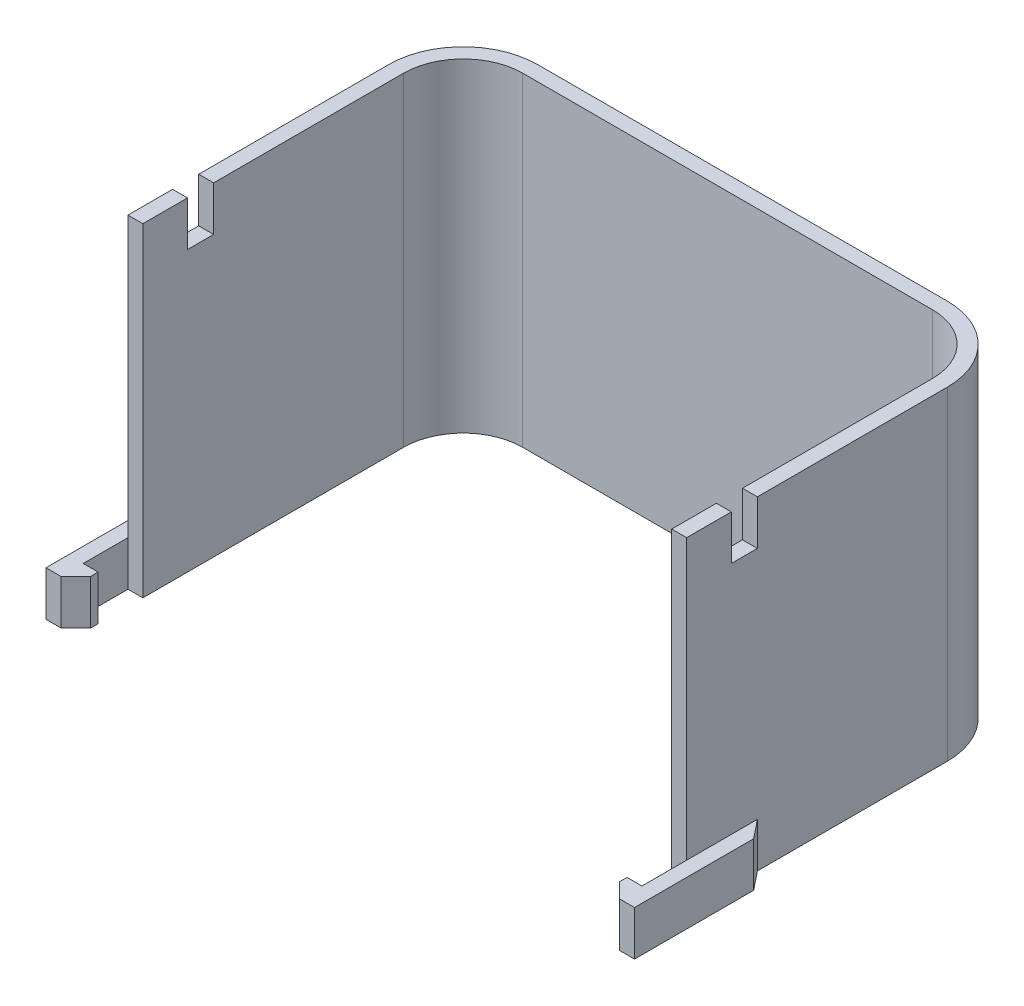
ISO-10303-21;
HEADER;
FILE_DESCRIPTION(('STEP AP214'),'2;1');
FILE_NAME('part.step','',(''),(''),'','','');
FILE_SCHEMA(('AUTOMOTIVE_DESIGN { 1 0 10303 214 1 1 1 1 }'));
ENDSEC;
DATA;
#1=APPLICATION_CONTEXT('core data for automotive mechanical design processes');
#2=APPLICATION_PROTOCOL_DEFINITION('international standard','automotive_design',2000,#1);
#3=PRODUCT_CONTEXT('',#1,'mechanical');
#4=PRODUCT('Part','Part','',(#3));
#5=PRODUCT_RELATED_PRODUCT_CATEGORY('part','',(#4));
#6=PRODUCT_DEFINITION_FORMATION('','',#4);
#7=PRODUCT_DEFINITION_CONTEXT('part definition',#1,'design');
#8=PRODUCT_DEFINITION('design','',#6,#7);
#9=PRODUCT_DEFINITION_SHAPE('','',#8);
#10=(LENGTH_UNIT() NAMED_UNIT(*) SI_UNIT(.MILLI.,.METRE.));
#11=(NAMED_UNIT(*) PLANE_ANGLE_UNIT() SI_UNIT($,.RADIAN.));
#12=(NAMED_UNIT(*) SI_UNIT($,.STERADIAN.) SOLID_ANGLE_UNIT());
#13=UNCERTAINTY_MEASURE_WITH_UNIT(LENGTH_MEASURE(1.E-05),#10,'distance_accuracy_value','');
#14=(GEOMETRIC_REPRESENTATION_CONTEXT(3) GLOBAL_UNCERTAINTY_ASSIGNED_CONTEXT((#13)) GLOBAL_UNIT_ASSIGNED_CONTEXT((#10,
#11,#12)) REPRESENTATION_CONTEXT('',''));
#15=CARTESIAN_POINT('',(0.,0.,0.));
#16=DIRECTION('',(0.,0.,1.));
#17=DIRECTION('',(1.,0.,0.));
#18=AXIS2_PLACEMENT_3D('',#15,#16,#17);
#19=CARTESIAN_POINT('',(0.,43.5,0.));
#20=DIRECTION('',(0.,-1.,0.));
#21=DIRECTION('',(0.,0.,-1.));
#22=AXIS2_PLACEMENT_3D('',#19,#20,#21);
#23=PLANE('',#22);
#24=DIRECTION('',(0.,0.,-1.));
#25=VECTOR('',#24,1.);
#26=CARTESIAN_POINT('',(-35.6068430701382,43.5,-43.));
#27=LINE('',#26,#25);
#28=CARTESIAN_POINT('',(-35.6068430701382,43.5,0.));
#29=VERTEX_POINT('',#28);
#30=CARTESIAN_POINT('',(-35.6068430701382,43.5,-6.));
#31=VERTEX_POINT('',#30);
#32=EDGE_CURVE('E510',#29,#31,#27,.T.);
#33=ORIENTED_EDGE('',*,*,#32,.T.);
#34=DIRECTION('',(-1.,0.,0.));
#35=VECTOR('',#34,1.);
#36=CARTESIAN_POINT('',(0.,43.5,-6.));
#37=LINE('',#36,#35);
#38=CARTESIAN_POINT('',(-37.6068430701382,43.5,-6.));
#39=VERTEX_POINT('',#38);
#40=EDGE_CURVE('E635',#31,#39,#37,.T.);
#41=ORIENTED_EDGE('',*,*,#40,.T.);
#42=DIRECTION('',(0.,0.,1.));
#43=VECTOR('',#42,1.);
#44=CARTESIAN_POINT('',(-37.6068430701382,43.5,0.));
#45=LINE('',#44,#43);
#46=CARTESIAN_POINT('',(-37.6068430701382,43.5,0.));
#47=VERTEX_POINT('',#46);
#48=EDGE_CURVE('E506',#39,#47,#45,.T.);
#49=ORIENTED_EDGE('',*,*,#48,.T.);
#50=DIRECTION('',(1.,0.,0.));
#51=VECTOR('',#50,1.);
#52=CARTESIAN_POINT('',(-37.6068430701382,43.5,0.));
#53=LINE('',#52,#51);
#54=EDGE_CURVE('E505',#47,#29,#53,.T.);
#55=ORIENTED_EDGE('',*,*,#54,.T.);
#56=EDGE_LOOP('',(#33,#41,#49,#55));
#57=FACE_BOUND('',#56,.T.);
#58=ADVANCED_FACE('F45',(#57),#23,.F.);
#59=DIRECTION('',(0.,0.,-1.));
#60=VECTOR('',#59,1.);
#61=CARTESIAN_POINT('',(37.3931569298619,43.5,0.));
#62=LINE('',#61,#60);
#63=CARTESIAN_POINT('',(37.3931569298619,43.5,0.));
#64=VERTEX_POINT('',#63);
#65=CARTESIAN_POINT('',(37.3931569298619,43.5,-6.));
#66=VERTEX_POINT('',#65);
#67=EDGE_CURVE('E527',#64,#66,#62,.T.);
#68=ORIENTED_EDGE('',*,*,#67,.T.);
#69=CARTESIAN_POINT('',(35.3931569298618,43.5,-6.));
#70=VERTEX_POINT('',#69);
#71=EDGE_CURVE('E54',#66,#70,#37,.T.);
#72=ORIENTED_EDGE('',*,*,#71,.T.);
#73=DIRECTION('',(0.,0.,1.));
#74=VECTOR('',#73,1.);
#75=CARTESIAN_POINT('',(35.3931569298618,43.5,-43.));
#76=LINE('',#75,#74);
#77=CARTESIAN_POINT('',(35.3931569298618,43.5,0.));
#78=VERTEX_POINT('',#77);
#79=EDGE_CURVE('E518',#70,#78,#76,.T.);
#80=ORIENTED_EDGE('',*,*,#79,.T.);
#81=DIRECTION('',(1.,0.,0.));
#82=VECTOR('',#81,1.);
#83=CARTESIAN_POINT('',(35.3931569298618,43.5,0.));
#84=LINE('',#83,#82);
#85=EDGE_CURVE('E523',#78,#64,#84,.T.);
#86=ORIENTED_EDGE('',*,*,#85,.T.);
#87=EDGE_LOOP('',(#68,#72,#80,#86));
#88=FACE_BOUND('',#87,.T.);
#89=ADVANCED_FACE('F751',(#88),#23,.F.);
#90=CARTESIAN_POINT('',(-37.6068430701382,43.5,0.));
#91=DIRECTION('',(1.,0.,0.));
#92=DIRECTION('',(0.,0.,-1.));
#93=AXIS2_PLACEMENT_3D('',#90,#91,#92);
#94=PLANE('',#93);
#95=DIRECTION('',(0.,0.,1.));
#96=VECTOR('',#95,1.);
#97=CARTESIAN_POINT('',(-37.6068430701382,0.,0.));
#98=LINE('',#97,#96);
#99=CARTESIAN_POINT('',(-37.6068430701382,0.,-35.));
#100=VERTEX_POINT('',#99);
#101=CARTESIAN_POINT('',(-37.6068430701382,0.,-9.5));
#102=VERTEX_POINT('',#101);
#103=EDGE_CURVE('E500',#100,#102,#98,.T.);
#104=ORIENTED_EDGE('',*,*,#103,.T.);
#105=DIRECTION('',(0.,-1.,0.));
#106=VECTOR('',#105,1.);
#107=CARTESIAN_POINT('',(-37.6068430701382,6.,-9.5));
#108=LINE('',#107,#106);
#109=CARTESIAN_POINT('',(-37.6068430701382,6.,-9.5));
#110=VERTEX_POINT('',#109);
#111=EDGE_CURVE('E61',#110,#102,#108,.T.);
#112=ORIENTED_EDGE('',*,*,#111,.F.);
#113=DIRECTION('',(0.,0.,1.));
#114=VECTOR('',#113,1.);
#115=CARTESIAN_POINT('',(-37.6068430701382,6.,-9.5));
#116=LINE('',#115,#114);
#117=CARTESIAN_POINT('',(-37.6068430701382,6.,0.));
#118=VERTEX_POINT('',#117);
#119=EDGE_CURVE('E65',#110,#118,#116,.T.);
#120=ORIENTED_EDGE('',*,*,#119,.T.);
#121=DIRECTION('',(0.,-1.,0.));
#122=VECTOR('',#121,1.);
#123=CARTESIAN_POINT('',(-37.6068430701382,43.5,0.));
#124=LINE('',#123,#122);
#125=EDGE_CURVE('E573',#47,#118,#124,.T.);
#126=ORIENTED_EDGE('',*,*,#125,.F.);
#127=ORIENTED_EDGE('',*,*,#48,.F.);
#128=DIRECTION('',(0.,-1.,0.));
#129=VECTOR('',#128,1.);
#130=CARTESIAN_POINT('',(-37.6068430701382,43.5,-6.));
#131=LINE('',#130,#129);
#132=CARTESIAN_POINT('',(-37.6068430701382,37.5,-6.));
#133=VERTEX_POINT('',#132);
#134=EDGE_CURVE('E484',#39,#133,#131,.T.);
#135=ORIENTED_EDGE('',*,*,#134,.T.);
#136=DIRECTION('',(0.,0.,-1.));
#137=VECTOR('',#136,1.);
#138=CARTESIAN_POINT('',(-37.6068430701382,37.5,0.));
#139=LINE('',#138,#137);
#140=CARTESIAN_POINT('',(-37.6068430701382,37.5,-9.5));
#141=VERTEX_POINT('',#140);
#142=EDGE_CURVE('E496',#133,#141,#139,.T.);
#143=ORIENTED_EDGE('',*,*,#142,.T.);
#144=DIRECTION('',(0.,1.,0.));
#145=VECTOR('',#144,1.);
#146=CARTESIAN_POINT('',(-37.6068430701382,43.5,-9.5));
#147=LINE('',#146,#145);
#148=CARTESIAN_POINT('',(-37.6068430701382,43.5,-9.5));
#149=VERTEX_POINT('',#148);
#150=EDGE_CURVE('E468',#141,#149,#147,.T.);
#151=ORIENTED_EDGE('',*,*,#150,.T.);
#152=CARTESIAN_POINT('',(-37.6068430701382,43.5,-35.));
#153=VERTEX_POINT('',#152);
#154=EDGE_CURVE('E501',#153,#149,#45,.T.);
#155=ORIENTED_EDGE('',*,*,#154,.F.);
#156=DIRECTION('',(0.,-1.,0.));
#157=VECTOR('',#156,1.);
#158=CARTESIAN_POINT('',(-37.6068430701382,43.5,-35.));
#159=LINE('',#158,#157);
#160=EDGE_CURVE('E603',#153,#100,#159,.T.);
#161=ORIENTED_EDGE('',*,*,#160,.T.);
#162=EDGE_LOOP('',(#104,#112,#120,#126,#127,#135,#143,#151,#155,#161));
#163=FACE_BOUND('',#162,.T.);
#164=ADVANCED_FACE('F731',(#163),#94,.F.);
#165=CARTESIAN_POINT('',(-37.6068430701382,43.5,0.));
#166=DIRECTION('',(0.,0.,-1.));
#167=DIRECTION('',(-1.,0.,0.));
#168=AXIS2_PLACEMENT_3D('',#165,#166,#167);
#169=PLANE('',#168);
#170=DIRECTION('',(1.,0.,0.));
#171=VECTOR('',#170,1.);
#172=CARTESIAN_POINT('',(-37.6068430701382,0.,0.));
#173=LINE('',#172,#171);
#174=CARTESIAN_POINT('',(-37.6068430701382,0.,0.));
#175=VERTEX_POINT('',#174);
#176=CARTESIAN_POINT('',(-35.6068430701382,0.,0.));
#177=VERTEX_POINT('',#176);
#178=EDGE_CURVE('E538',#175,#177,#173,.T.);
#179=ORIENTED_EDGE('',*,*,#178,.T.);
#180=DIRECTION('',(0.,-1.,0.));
#181=VECTOR('',#180,1.);
#182=CARTESIAN_POINT('',(-35.6068430701382,43.5,0.));
#183=LINE('',#182,#181);
#184=EDGE_CURVE('E569',#29,#177,#183,.T.);
#185=ORIENTED_EDGE('',*,*,#184,.F.);
#186=ORIENTED_EDGE('',*,*,#54,.F.);
#187=ORIENTED_EDGE('',*,*,#125,.T.);
#188=DIRECTION('',(0.,-1.,0.));
#189=VECTOR('',#188,1.);
#190=CARTESIAN_POINT('',(-37.6068430701382,43.5,0.));
#191=LINE('',#190,#189);
#192=EDGE_CURVE('E280',#118,#175,#191,.T.);
#193=ORIENTED_EDGE('',*,*,#192,.T.);
#194=EDGE_LOOP('',(#179,#185,#186,#187,#193));
#195=FACE_BOUND('',#194,.T.);
#196=ADVANCED_FACE('F668',(#195),#169,.F.);
#197=CARTESIAN_POINT('',(-35.6068430701382,43.5,-43.));
#198=DIRECTION('',(-1.,0.,0.));
#199=DIRECTION('',(0.,0.,1.));
#200=AXIS2_PLACEMENT_3D('',#197,#198,#199);
#201=PLANE('',#200);
#202=DIRECTION('',(0.,0.,1.));
#203=VECTOR('',#202,1.);
#204=CARTESIAN_POINT('',(-35.6068430701382,37.5,-43.));
#205=LINE('',#204,#203);
#206=CARTESIAN_POINT('',(-35.6068430701382,37.5,-9.5));
#207=VERTEX_POINT('',#206);
#208=CARTESIAN_POINT('',(-35.6068430701382,37.5,-6.));
#209=VERTEX_POINT('',#208);
#210=EDGE_CURVE('E492',#207,#209,#205,.T.);
#211=ORIENTED_EDGE('',*,*,#210,.T.);
#212=DIRECTION('',(0.,1.,0.));
#213=VECTOR('',#212,1.);
#214=CARTESIAN_POINT('',(-35.6068430701382,43.5,-6.));
#215=LINE('',#214,#213);
#216=EDGE_CURVE('E480',#209,#31,#215,.T.);
#217=ORIENTED_EDGE('',*,*,#216,.T.);
#218=ORIENTED_EDGE('',*,*,#32,.F.);
#219=ORIENTED_EDGE('',*,*,#184,.T.);
#220=DIRECTION('',(0.,0.,-1.));
#221=VECTOR('',#220,1.);
#222=CARTESIAN_POINT('',(-35.6068430701382,0.,-43.));
#223=LINE('',#222,#221);
#224=CARTESIAN_POINT('',(-35.6068430701382,0.,-35.));
#225=VERTEX_POINT('',#224);
#226=EDGE_CURVE('E541',#177,#225,#223,.T.);
#227=ORIENTED_EDGE('',*,*,#226,.T.);
#228=DIRECTION('',(0.,-1.,0.));
#229=VECTOR('',#228,1.);
#230=CARTESIAN_POINT('',(-35.6068430701382,43.5,-35.));
#231=LINE('',#230,#229);
#232=CARTESIAN_POINT('',(-35.6068430701382,43.5,-35.));
#233=VERTEX_POINT('',#232);
#234=EDGE_CURVE('E587',#225,#233,#231,.F.);
#235=ORIENTED_EDGE('',*,*,#234,.T.);
#236=CARTESIAN_POINT('',(-35.6068430701382,43.5,-9.5));
#237=VERTEX_POINT('',#236);
#238=EDGE_CURVE('E509',#237,#233,#27,.T.);
#239=ORIENTED_EDGE('',*,*,#238,.F.);
#240=DIRECTION('',(0.,-1.,0.));
#241=VECTOR('',#240,1.);
#242=CARTESIAN_POINT('',(-35.6068430701382,43.5,-9.5));
#243=LINE('',#242,#241);
#244=EDGE_CURVE('E464',#237,#207,#243,.T.);
#245=ORIENTED_EDGE('',*,*,#244,.T.);
#246=EDGE_LOOP('',(#211,#217,#218,#219,#227,#235,#239,#245));
#247=FACE_BOUND('',#246,.T.);
#248=ADVANCED_FACE('F650',(#247),#201,.F.);
#249=CARTESIAN_POINT('',(-35.6068430701382,43.5,-43.));
#250=DIRECTION('',(0.,0.,-1.));
#251=DIRECTION('',(-1.,0.,0.));
#252=AXIS2_PLACEMENT_3D('',#249,#250,#251);
#253=PLANE('',#252);
#254=DIRECTION('',(1.,0.,0.));
#255=VECTOR('',#254,1.);
#256=CARTESIAN_POINT('',(-35.6068430701382,0.,-43.));
#257=LINE('',#256,#255);
#258=CARTESIAN_POINT('',(-27.6068430701382,0.,-43.));
#259=VERTEX_POINT('',#258);
#260=CARTESIAN_POINT('',(27.3931569298618,0.,-43.));
#261=VERTEX_POINT('',#260);
#262=EDGE_CURVE('E545',#259,#261,#257,.T.);
#263=ORIENTED_EDGE('',*,*,#262,.T.);
#264=DIRECTION('',(0.,-1.,0.));
#265=VECTOR('',#264,1.);
#266=CARTESIAN_POINT('',(27.3931569298618,43.5,-43.));
#267=LINE('',#266,#265);
#268=CARTESIAN_POINT('',(27.3931569298618,43.5,-43.));
#269=VERTEX_POINT('',#268);
#270=EDGE_CURVE('E584',#261,#269,#267,.F.);
#271=ORIENTED_EDGE('',*,*,#270,.T.);
#272=DIRECTION('',(1.,0.,0.));
#273=VECTOR('',#272,1.);
#274=CARTESIAN_POINT('',(-35.6068430701382,43.5,-43.));
#275=LINE('',#274,#273);
#276=CARTESIAN_POINT('',(-27.6068430701382,43.5,-43.));
#277=VERTEX_POINT('',#276);
#278=EDGE_CURVE('E514',#277,#269,#275,.T.);
#279=ORIENTED_EDGE('',*,*,#278,.F.);
#280=DIRECTION('',(0.,-1.,0.));
#281=VECTOR('',#280,1.);
#282=CARTESIAN_POINT('',(-27.6068430701382,0.,-43.));
#283=LINE('',#282,#281);
#284=EDGE_CURVE('E580',#277,#259,#283,.T.);
#285=ORIENTED_EDGE('',*,*,#284,.T.);
#286=EDGE_LOOP('',(#263,#271,#279,#285));
#287=FACE_BOUND('',#286,.T.);
#288=ADVANCED_FACE('F679',(#287),#253,.F.);
#289=CARTESIAN_POINT('',(35.3931569298618,43.5,-43.));
#290=DIRECTION('',(1.,0.,0.));
#291=DIRECTION('',(0.,0.,-1.));
#292=AXIS2_PLACEMENT_3D('',#289,#290,#291);
#293=PLANE('',#292);
#294=ORIENTED_EDGE('',*,*,#79,.F.);
#295=DIRECTION('',(0.,-1.,0.));
#296=VECTOR('',#295,1.);
#297=CARTESIAN_POINT('',(35.3931569298618,43.5,-6.));
#298=LINE('',#297,#296);
#299=CARTESIAN_POINT('',(35.3931569298618,37.5,-6.));
#300=VERTEX_POINT('',#299);
#301=EDGE_CURVE('E476',#70,#300,#298,.T.);
#302=ORIENTED_EDGE('',*,*,#301,.T.);
#303=DIRECTION('',(0.,0.,-1.));
#304=VECTOR('',#303,1.);
#305=CARTESIAN_POINT('',(35.3931569298618,37.5,-43.));
#306=LINE('',#305,#304);
#307=CARTESIAN_POINT('',(35.3931569298618,37.5,-9.5));
#308=VERTEX_POINT('',#307);
#309=EDGE_CURVE('E488',#300,#308,#306,.T.);
#310=ORIENTED_EDGE('',*,*,#309,.T.);
#311=DIRECTION('',(0.,1.,0.));
#312=VECTOR('',#311,1.);
#313=CARTESIAN_POINT('',(35.3931569298618,43.5,-9.5));
#314=LINE('',#313,#312);
#315=CARTESIAN_POINT('',(35.3931569298618,43.5,-9.5));
#316=VERTEX_POINT('',#315);
#317=EDGE_CURVE('E460',#308,#316,#314,.T.);
#318=ORIENTED_EDGE('',*,*,#317,.T.);
#319=CARTESIAN_POINT('',(35.3931569298618,43.5,-35.));
#320=VERTEX_POINT('',#319);
#321=EDGE_CURVE('E519',#320,#316,#76,.T.);
#322=ORIENTED_EDGE('',*,*,#321,.F.);
#323=DIRECTION('',(0.,-1.,0.));
#324=VECTOR('',#323,1.);
#325=CARTESIAN_POINT('',(35.3931569298618,0.,-35.));
#326=LINE('',#325,#324);
#327=CARTESIAN_POINT('',(35.3931569298618,0.,-35.));
#328=VERTEX_POINT('',#327);
#329=EDGE_CURVE('E576',#320,#328,#326,.T.);
#330=ORIENTED_EDGE('',*,*,#329,.T.);
#331=DIRECTION('',(0.,0.,1.));
#332=VECTOR('',#331,1.);
#333=CARTESIAN_POINT('',(35.3931569298618,0.,-43.));
#334=LINE('',#333,#332);
#335=CARTESIAN_POINT('',(35.3931569298618,0.,0.));
#336=VERTEX_POINT('',#335);
#337=EDGE_CURVE('E549',#328,#336,#334,.T.);
#338=ORIENTED_EDGE('',*,*,#337,.T.);
#339=DIRECTION('',(0.,-1.,0.));
#340=VECTOR('',#339,1.);
#341=CARTESIAN_POINT('',(35.3931569298618,43.5,0.));
#342=LINE('',#341,#340);
#343=EDGE_CURVE('E565',#78,#336,#342,.T.);
#344=ORIENTED_EDGE('',*,*,#343,.F.);
#345=EDGE_LOOP('',(#294,#302,#310,#318,#322,#330,#338,#344));
#346=FACE_BOUND('',#345,.T.);
#347=ADVANCED_FACE('F689',(#346),#293,.F.);
#348=CARTESIAN_POINT('',(35.3931569298618,43.5,0.));
#349=DIRECTION('',(0.,0.,-1.));
#350=DIRECTION('',(-1.,0.,0.));
#351=AXIS2_PLACEMENT_3D('',#348,#349,#350);
#352=PLANE('',#351);
#353=DIRECTION('',(1.,0.,0.));
#354=VECTOR('',#353,1.);
#355=CARTESIAN_POINT('',(35.3931569298618,0.,0.));
#356=LINE('',#355,#354);
#357=CARTESIAN_POINT('',(37.3931569298619,0.,0.));
#358=VERTEX_POINT('',#357);
#359=EDGE_CURVE('E552',#336,#358,#356,.T.);
#360=ORIENTED_EDGE('',*,*,#359,.T.);
#361=DIRECTION('',(0.,1.,0.));
#362=VECTOR('',#361,1.);
#363=CARTESIAN_POINT('',(37.3931569298619,43.5,0.));
#364=LINE('',#363,#362);
#365=CARTESIAN_POINT('',(37.3931569298619,6.,0.));
#366=VERTEX_POINT('',#365);
#367=EDGE_CURVE('E349',#358,#366,#364,.T.);
#368=ORIENTED_EDGE('',*,*,#367,.T.);
#369=DIRECTION('',(0.,-1.,0.));
#370=VECTOR('',#369,1.);
#371=CARTESIAN_POINT('',(37.3931569298619,43.5,0.));
#372=LINE('',#371,#370);
#373=EDGE_CURVE('E535',#64,#366,#372,.T.);
#374=ORIENTED_EDGE('',*,*,#373,.F.);
#375=ORIENTED_EDGE('',*,*,#85,.F.);
#376=ORIENTED_EDGE('',*,*,#343,.T.);
#377=EDGE_LOOP('',(#360,#368,#374,#375,#376));
#378=FACE_BOUND('',#377,.T.);
#379=ADVANCED_FACE('F695',(#378),#352,.F.);
#380=CARTESIAN_POINT('',(37.3931569298619,43.5,0.));
#381=DIRECTION('',(-1.,0.,0.));
#382=DIRECTION('',(0.,0.,1.));
#383=AXIS2_PLACEMENT_3D('',#380,#381,#382);
#384=PLANE('',#383);
#385=DIRECTION('',(0.,0.,-1.));
#386=VECTOR('',#385,1.);
#387=CARTESIAN_POINT('',(37.3931569298618,6.,-9.5));
#388=LINE('',#387,#386);
#389=CARTESIAN_POINT('',(37.3931569298619,6.,-9.5));
#390=VERTEX_POINT('',#389);
#391=EDGE_CURVE('E438',#366,#390,#388,.T.);
#392=ORIENTED_EDGE('',*,*,#391,.T.);
#393=DIRECTION('',(0.,-1.,0.));
#394=VECTOR('',#393,1.);
#395=CARTESIAN_POINT('',(37.3931569298618,6.,-9.5));
#396=LINE('',#395,#394);
#397=CARTESIAN_POINT('',(37.3931569298618,0.,-9.5));
#398=VERTEX_POINT('',#397);
#399=EDGE_CURVE('E364',#390,#398,#396,.T.);
#400=ORIENTED_EDGE('',*,*,#399,.T.);
#401=DIRECTION('',(0.,0.,-1.));
#402=VECTOR('',#401,1.);
#403=CARTESIAN_POINT('',(37.3931569298619,0.,0.));
#404=LINE('',#403,#402);
#405=CARTESIAN_POINT('',(37.3931569298618,0.,-35.));
#406=VERTEX_POINT('',#405);
#407=EDGE_CURVE('E555',#398,#406,#404,.T.);
#408=ORIENTED_EDGE('',*,*,#407,.T.);
#409=DIRECTION('',(0.,-1.,0.));
#410=VECTOR('',#409,1.);
#411=CARTESIAN_POINT('',(37.3931569298618,43.5,-35.));
#412=LINE('',#411,#410);
#413=CARTESIAN_POINT('',(37.3931569298618,43.5,-35.));
#414=VERTEX_POINT('',#413);
#415=EDGE_CURVE('E627',#406,#414,#412,.F.);
#416=ORIENTED_EDGE('',*,*,#415,.T.);
#417=CARTESIAN_POINT('',(37.3931569298619,43.5,-9.5));
#418=VERTEX_POINT('',#417);
#419=EDGE_CURVE('E526',#418,#414,#62,.T.);
#420=ORIENTED_EDGE('',*,*,#419,.F.);
#421=DIRECTION('',(0.,-1.,0.));
#422=VECTOR('',#421,1.);
#423=CARTESIAN_POINT('',(37.3931569298619,43.5,-9.5));
#424=LINE('',#423,#422);
#425=CARTESIAN_POINT('',(37.3931569298619,37.5,-9.5));
#426=VERTEX_POINT('',#425);
#427=EDGE_CURVE('E456',#418,#426,#424,.T.);
#428=ORIENTED_EDGE('',*,*,#427,.T.);
#429=DIRECTION('',(0.,0.,1.));
#430=VECTOR('',#429,1.);
#431=CARTESIAN_POINT('',(37.3931569298619,37.5,0.));
#432=LINE('',#431,#430);
#433=CARTESIAN_POINT('',(37.3931569298619,37.5,-6.));
#434=VERTEX_POINT('',#433);
#435=EDGE_CURVE('E11',#426,#434,#432,.T.);
#436=ORIENTED_EDGE('',*,*,#435,.T.);
#437=DIRECTION('',(0.,1.,0.));
#438=VECTOR('',#437,1.);
#439=CARTESIAN_POINT('',(37.3931569298619,43.5,-6.));
#440=LINE('',#439,#438);
#441=EDGE_CURVE('E472',#434,#66,#440,.T.);
#442=ORIENTED_EDGE('',*,*,#441,.T.);
#443=ORIENTED_EDGE('',*,*,#67,.F.);
#444=ORIENTED_EDGE('',*,*,#373,.T.);
#445=EDGE_LOOP('',(#392,#400,#408,#416,#420,#428,#436,#442,#443,#444));
#446=FACE_BOUND('',#445,.T.);
#447=ADVANCED_FACE('F711',(#446),#384,.F.);
#448=CARTESIAN_POINT('',(-37.6068430701382,43.5,-45.));
#449=DIRECTION('',(0.,0.,1.));
#450=DIRECTION('',(1.,0.,0.));
#451=AXIS2_PLACEMENT_3D('',#448,#449,#450);
#452=PLANE('',#451);
#453=DIRECTION('',(-1.,0.,0.));
#454=VECTOR('',#453,1.);
#455=CARTESIAN_POINT('',(-37.6068430701382,0.,-45.));
#456=LINE('',#455,#454);
#457=CARTESIAN_POINT('',(27.3931569298618,0.,-45.));
#458=VERTEX_POINT('',#457);
#459=CARTESIAN_POINT('',(-27.6068430701382,0.,-45.));
#460=VERTEX_POINT('',#459);
#461=EDGE_CURVE('E558',#458,#460,#456,.T.);
#462=ORIENTED_EDGE('',*,*,#461,.T.);
#463=DIRECTION('',(0.,-1.,0.));
#464=VECTOR('',#463,1.);
#465=CARTESIAN_POINT('',(-27.6068430701382,43.5,-45.));
#466=LINE('',#465,#464);
#467=CARTESIAN_POINT('',(-27.6068430701382,43.5,-45.));
#468=VERTEX_POINT('',#467);
#469=EDGE_CURVE('E618',#460,#468,#466,.F.);
#470=ORIENTED_EDGE('',*,*,#469,.T.);
#471=DIRECTION('',(-1.,0.,0.));
#472=VECTOR('',#471,1.);
#473=CARTESIAN_POINT('',(-37.6068430701382,43.5,-45.));
#474=LINE('',#473,#472);
#475=CARTESIAN_POINT('',(27.3931569298618,43.5,-45.));
#476=VERTEX_POINT('',#475);
#477=EDGE_CURVE('E531',#476,#468,#474,.T.);
#478=ORIENTED_EDGE('',*,*,#477,.F.);
#479=DIRECTION('',(0.,-1.,0.));
#480=VECTOR('',#479,1.);
#481=CARTESIAN_POINT('',(27.3931569298618,43.5,-45.));
#482=LINE('',#481,#480);
#483=EDGE_CURVE('E614',#476,#458,#482,.T.);
#484=ORIENTED_EDGE('',*,*,#483,.T.);
#485=EDGE_LOOP('',(#462,#470,#478,#484));
#486=FACE_BOUND('',#485,.T.);
#487=ADVANCED_FACE('F726',(#486),#452,.F.);
#488=ORIENTED_EDGE('',*,*,#154,.T.);
#489=DIRECTION('',(1.,0.,0.));
#490=VECTOR('',#489,1.);
#491=CARTESIAN_POINT('',(0.,43.5,-9.5));
#492=LINE('',#491,#490);
#493=EDGE_CURVE('E634',#149,#237,#492,.T.);
#494=ORIENTED_EDGE('',*,*,#493,.T.);
#495=ORIENTED_EDGE('',*,*,#238,.T.);
#496=CARTESIAN_POINT('',(-27.6068430701382,43.5,-35.));
#497=DIRECTION('',(0.,-1.,0.));
#498=DIRECTION('',(0.,0.,-1.));
#499=AXIS2_PLACEMENT_3D('',#496,#497,#498);
#500=CIRCLE('',#499,8.);
#501=EDGE_CURVE('E600',#233,#277,#500,.T.);
#502=ORIENTED_EDGE('',*,*,#501,.T.);
#503=ORIENTED_EDGE('',*,*,#278,.T.);
#504=CARTESIAN_POINT('',(27.3931569298618,43.5,-35.));
#505=DIRECTION('',(0.,-1.,0.));
#506=DIRECTION('',(0.,0.,-1.));
#507=AXIS2_PLACEMENT_3D('',#504,#505,#506);
#508=CIRCLE('',#507,8.);
#509=EDGE_CURVE('E594',#269,#320,#508,.T.);
#510=ORIENTED_EDGE('',*,*,#509,.T.);
#511=ORIENTED_EDGE('',*,*,#321,.T.);
#512=EDGE_CURVE('E631',#316,#418,#492,.T.);
#513=ORIENTED_EDGE('',*,*,#512,.T.);
#514=ORIENTED_EDGE('',*,*,#419,.T.);
#515=CARTESIAN_POINT('',(27.3931569298618,43.5,-35.));
#516=DIRECTION('',(0.,-1.,0.));
#517=DIRECTION('',(0.,0.,-1.));
#518=AXIS2_PLACEMENT_3D('',#515,#516,#517);
#519=CIRCLE('',#518,10.);
#520=EDGE_CURVE('E621',#414,#476,#519,.F.);
#521=ORIENTED_EDGE('',*,*,#520,.T.);
#522=ORIENTED_EDGE('',*,*,#477,.T.);
#523=CARTESIAN_POINT('',(-27.6068430701382,43.5,-35.));
#524=DIRECTION('',(0.,-1.,0.));
#525=DIRECTION('',(0.,0.,-1.));
#526=AXIS2_PLACEMENT_3D('',#523,#524,#525);
#527=CIRCLE('',#526,10.);
#528=EDGE_CURVE('E624',#468,#153,#527,.F.);
#529=ORIENTED_EDGE('',*,*,#528,.T.);
#530=EDGE_LOOP('',(#488,#494,#495,#502,#503,#510,#511,#513,#514,#521,#522,#529));
#531=FACE_BOUND('',#530,.T.);
#532=ADVANCED_FACE('F646',(#531),#23,.F.);
#533=CARTESIAN_POINT('',(0.,0.,0.));
#534=DIRECTION('',(0.,-1.,0.));
#535=DIRECTION('',(0.,0.,-1.));
#536=AXIS2_PLACEMENT_3D('',#533,#534,#535);
#537=PLANE('',#536);
#538=ORIENTED_EDGE('',*,*,#103,.F.);
#539=CARTESIAN_POINT('',(-27.6068430701382,0.,-35.));
#540=DIRECTION('',(0.,-1.,0.));
#541=DIRECTION('',(0.,0.,-1.));
#542=AXIS2_PLACEMENT_3D('',#539,#540,#541);
#543=CIRCLE('',#542,10.);
#544=EDGE_CURVE('E611',#100,#460,#543,.T.);
#545=ORIENTED_EDGE('',*,*,#544,.T.);
#546=ORIENTED_EDGE('',*,*,#461,.F.);
#547=CARTESIAN_POINT('',(27.3931569298618,0.,-35.));
#548=DIRECTION('',(0.,-1.,0.));
#549=DIRECTION('',(0.,0.,-1.));
#550=AXIS2_PLACEMENT_3D('',#547,#548,#549);
#551=CIRCLE('',#550,10.);
#552=EDGE_CURVE('E607',#458,#406,#551,.T.);
#553=ORIENTED_EDGE('',*,*,#552,.T.);
#554=ORIENTED_EDGE('',*,*,#407,.F.);
#555=DIRECTION('',(0.624695047554426,0.,0.780868809443029));
#556=VECTOR('',#555,1.);
#557=CARTESIAN_POINT('',(39.3931569298619,0.,-7.));
#558=LINE('',#557,#556);
#559=CARTESIAN_POINT('',(39.3931569298619,0.,-7.));
#560=VERTEX_POINT('',#559);
#561=EDGE_CURVE('E325',#398,#560,#558,.T.);
#562=ORIENTED_EDGE('',*,*,#561,.T.);
#563=DIRECTION('',(0.,0.,1.));
#564=VECTOR('',#563,1.);
#565=CARTESIAN_POINT('',(39.3931569298619,0.,-7.));
#566=LINE('',#565,#564);
#567=CARTESIAN_POINT('',(39.3931569298619,0.,9.));
#568=VERTEX_POINT('',#567);
#569=EDGE_CURVE('E408',#560,#568,#566,.T.);
#570=ORIENTED_EDGE('',*,*,#569,.T.);
#571=DIRECTION('',(-1.,0.,0.));
#572=VECTOR('',#571,1.);
#573=CARTESIAN_POINT('',(37.3931569298619,0.,9.));
#574=LINE('',#573,#572);
#575=CARTESIAN_POINT('',(37.3931569298619,0.,9.));
#576=VERTEX_POINT('',#575);
#577=EDGE_CURVE('E404',#568,#576,#574,.T.);
#578=ORIENTED_EDGE('',*,*,#577,.T.);
#579=DIRECTION('',(-0.707106781186548,0.,-0.707106781186547));
#580=VECTOR('',#579,1.);
#581=CARTESIAN_POINT('',(37.3931569298619,0.,9.));
#582=LINE('',#581,#580);
#583=CARTESIAN_POINT('',(35.3931569298619,0.,7.));
#584=VERTEX_POINT('',#583);
#585=EDGE_CURVE('E400',#576,#584,#582,.T.);
#586=ORIENTED_EDGE('',*,*,#585,.T.);
#587=DIRECTION('',(0.,0.,-1.));
#588=VECTOR('',#587,1.);
#589=CARTESIAN_POINT('',(35.3931569298619,0.,7.));
#590=LINE('',#589,#588);
#591=CARTESIAN_POINT('',(35.3931569298619,0.,6.));
#592=VERTEX_POINT('',#591);
#593=EDGE_CURVE('E396',#584,#592,#590,.T.);
#594=ORIENTED_EDGE('',*,*,#593,.T.);
#595=DIRECTION('',(1.,0.,0.));
#596=VECTOR('',#595,1.);
#597=CARTESIAN_POINT('',(35.3931569298619,0.,6.));
#598=LINE('',#597,#596);
#599=CARTESIAN_POINT('',(37.3931569298619,0.,6.));
#600=VERTEX_POINT('',#599);
#601=EDGE_CURVE('E391',#592,#600,#598,.T.);
#602=ORIENTED_EDGE('',*,*,#601,.T.);
#603=DIRECTION('',(0.,0.,-1.));
#604=VECTOR('',#603,1.);
#605=CARTESIAN_POINT('',(37.3931569298619,0.,-7.));
#606=LINE('',#605,#604);
#607=EDGE_CURVE('E387',#600,#358,#606,.T.);
#608=ORIENTED_EDGE('',*,*,#607,.T.);
#609=ORIENTED_EDGE('',*,*,#359,.F.);
#610=ORIENTED_EDGE('',*,*,#337,.F.);
#611=CARTESIAN_POINT('',(27.3931569298618,0.,-35.));
#612=DIRECTION('',(0.,-1.,0.));
#613=DIRECTION('',(0.,0.,-1.));
#614=AXIS2_PLACEMENT_3D('',#611,#612,#613);
#615=CIRCLE('',#614,8.);
#616=EDGE_CURVE('E591',#328,#261,#615,.F.);
#617=ORIENTED_EDGE('',*,*,#616,.T.);
#618=ORIENTED_EDGE('',*,*,#262,.F.);
#619=CARTESIAN_POINT('',(-27.6068430701382,0.,-35.));
#620=DIRECTION('',(0.,-1.,0.));
#621=DIRECTION('',(0.,0.,-1.));
#622=AXIS2_PLACEMENT_3D('',#619,#620,#621);
#623=CIRCLE('',#622,8.);
#624=EDGE_CURVE('E597',#259,#225,#623,.F.);
#625=ORIENTED_EDGE('',*,*,#624,.T.);
#626=ORIENTED_EDGE('',*,*,#226,.F.);
#627=ORIENTED_EDGE('',*,*,#178,.F.);
#628=DIRECTION('',(0.,0.,1.));
#629=VECTOR('',#628,1.);
#630=CARTESIAN_POINT('',(-37.6068430701382,0.,-7.));
#631=LINE('',#630,#629);
#632=CARTESIAN_POINT('',(-37.6068430701382,0.,6.));
#633=VERTEX_POINT('',#632);
#634=EDGE_CURVE('E322',#175,#633,#631,.T.);
#635=ORIENTED_EDGE('',*,*,#634,.T.);
#636=DIRECTION('',(1.,0.,0.));
#637=VECTOR('',#636,1.);
#638=CARTESIAN_POINT('',(-35.6068430701382,0.,6.));
#639=LINE('',#638,#637);
#640=CARTESIAN_POINT('',(-35.6068430701382,0.,6.));
#641=VERTEX_POINT('',#640);
#642=EDGE_CURVE('E291',#633,#641,#639,.T.);
#643=ORIENTED_EDGE('',*,*,#642,.T.);
#644=DIRECTION('',(0.,0.,1.));
#645=VECTOR('',#644,1.);
#646=CARTESIAN_POINT('',(-35.6068430701382,0.,7.));
#647=LINE('',#646,#645);
#648=CARTESIAN_POINT('',(-35.6068430701382,0.,7.));
#649=VERTEX_POINT('',#648);
#650=EDGE_CURVE('E328',#641,#649,#647,.T.);
#651=ORIENTED_EDGE('',*,*,#650,.T.);
#652=DIRECTION('',(-0.707106781186548,0.,0.707106781186547));
#653=VECTOR('',#652,1.);
#654=CARTESIAN_POINT('',(-37.6068430701382,0.,9.));
#655=LINE('',#654,#653);
#656=CARTESIAN_POINT('',(-37.6068430701382,0.,9.));
#657=VERTEX_POINT('',#656);
#658=EDGE_CURVE('E332',#649,#657,#655,.T.);
#659=ORIENTED_EDGE('',*,*,#658,.T.);
#660=DIRECTION('',(-1.,0.,0.));
#661=VECTOR('',#660,1.);
#662=CARTESIAN_POINT('',(-37.6068430701382,0.,9.));
#663=LINE('',#662,#661);
#664=CARTESIAN_POINT('',(-39.6068430701382,0.,9.));
#665=VERTEX_POINT('',#664);
#666=EDGE_CURVE('E336',#657,#665,#663,.T.);
#667=ORIENTED_EDGE('',*,*,#666,.T.);
#668=DIRECTION('',(0.,0.,-1.));
#669=VECTOR('',#668,1.);
#670=CARTESIAN_POINT('',(-39.6068430701382,0.,-7.));
#671=LINE('',#670,#669);
#672=CARTESIAN_POINT('',(-39.6068430701382,0.,-7.));
#673=VERTEX_POINT('',#672);
#674=EDGE_CURVE('E340',#665,#673,#671,.T.);
#675=ORIENTED_EDGE('',*,*,#674,.T.);
#676=DIRECTION('',(0.624695047554425,0.,-0.78086880944303));
#677=VECTOR('',#676,1.);
#678=CARTESIAN_POINT('',(-39.6068430701382,0.,-7.));
#679=LINE('',#678,#677);
#680=EDGE_CURVE('E284',#673,#102,#679,.T.);
#681=ORIENTED_EDGE('',*,*,#680,.T.);
#682=EDGE_LOOP('',(#538,#545,#546,#553,#554,#562,#570,#578,#586,#594,#602,#608,#609,#610,#617,
#618,#625,#626,#627,#635,#643,#651,#659,#667,#675,#681));
#683=FACE_BOUND('',#682,.T.);
#684=ADVANCED_FACE('F672',(#683),#537,.T.);
#685=CARTESIAN_POINT('',(27.3931569298618,43.5,-35.));
#686=DIRECTION('',(0.,1.,0.));
#687=DIRECTION('',(0.,0.,1.));
#688=AXIS2_PLACEMENT_3D('',#685,#686,#687);
#689=CYLINDRICAL_SURFACE('',#688,8.);
#690=ORIENTED_EDGE('',*,*,#509,.F.);
#691=ORIENTED_EDGE('',*,*,#270,.F.);
#692=ORIENTED_EDGE('',*,*,#616,.F.);
#693=ORIENTED_EDGE('',*,*,#329,.F.);
#694=EDGE_LOOP('',(#690,#691,#692,#693));
#695=FACE_BOUND('',#694,.T.);
#696=ADVANCED_FACE('F685',(#695),#689,.F.);
#697=CARTESIAN_POINT('',(-27.6068430701382,43.5,-35.));
#698=DIRECTION('',(0.,1.,0.));
#699=DIRECTION('',(0.,0.,1.));
#700=AXIS2_PLACEMENT_3D('',#697,#698,#699);
#701=CYLINDRICAL_SURFACE('',#700,8.);
#702=ORIENTED_EDGE('',*,*,#501,.F.);
#703=ORIENTED_EDGE('',*,*,#234,.F.);
#704=ORIENTED_EDGE('',*,*,#624,.F.);
#705=ORIENTED_EDGE('',*,*,#284,.F.);
#706=EDGE_LOOP('',(#702,#703,#704,#705));
#707=FACE_BOUND('',#706,.T.);
#708=ADVANCED_FACE('F676',(#707),#701,.F.);
#709=CARTESIAN_POINT('',(-27.6068430701382,43.5,-35.));
#710=DIRECTION('',(0.,-1.,0.));
#711=DIRECTION('',(0.,0.,-1.));
#712=AXIS2_PLACEMENT_3D('',#709,#710,#711);
#713=CYLINDRICAL_SURFACE('',#712,10.);
#714=ORIENTED_EDGE('',*,*,#528,.F.);
#715=ORIENTED_EDGE('',*,*,#469,.F.);
#716=ORIENTED_EDGE('',*,*,#544,.F.);
#717=ORIENTED_EDGE('',*,*,#160,.F.);
#718=EDGE_LOOP('',(#714,#715,#716,#717));
#719=FACE_BOUND('',#718,.T.);
#720=ADVANCED_FACE('F729',(#719),#713,.T.);
#721=CARTESIAN_POINT('',(27.3931569298618,43.5,-35.));
#722=DIRECTION('',(0.,-1.,0.));
#723=DIRECTION('',(0.,0.,-1.));
#724=AXIS2_PLACEMENT_3D('',#721,#722,#723);
#725=CYLINDRICAL_SURFACE('',#724,10.);
#726=ORIENTED_EDGE('',*,*,#520,.F.);
#727=ORIENTED_EDGE('',*,*,#415,.F.);
#728=ORIENTED_EDGE('',*,*,#552,.F.);
#729=ORIENTED_EDGE('',*,*,#483,.F.);
#730=EDGE_LOOP('',(#726,#727,#728,#729));
#731=FACE_BOUND('',#730,.T.);
#732=ADVANCED_FACE('F47',(#731),#725,.T.);
#733=CARTESIAN_POINT('',(-57.75,43.5,-9.5));
#734=DIRECTION('',(0.,0.,-1.));
#735=DIRECTION('',(-1.,0.,0.));
#736=AXIS2_PLACEMENT_3D('',#733,#734,#735);
#737=PLANE('',#736);
#738=DIRECTION('',(1.,0.,0.));
#739=VECTOR('',#738,1.);
#740=CARTESIAN_POINT('',(-57.75,37.5,-9.5));
#741=LINE('',#740,#739);
#742=EDGE_CURVE('E447',#308,#426,#741,.T.);
#743=ORIENTED_EDGE('',*,*,#742,.T.);
#744=ORIENTED_EDGE('',*,*,#427,.F.);
#745=ORIENTED_EDGE('',*,*,#512,.F.);
#746=ORIENTED_EDGE('',*,*,#317,.F.);
#747=EDGE_LOOP('',(#743,#744,#745,#746));
#748=FACE_BOUND('',#747,.T.);
#749=ADVANCED_FACE('F736',(#748),#737,.F.);
#750=CARTESIAN_POINT('',(-57.75,43.5,-6.));
#751=DIRECTION('',(0.,0.,1.));
#752=DIRECTION('',(0.,-1.,0.));
#753=AXIS2_PLACEMENT_3D('',#750,#751,#752);
#754=PLANE('',#753);
#755=ORIENTED_EDGE('',*,*,#71,.F.);
#756=ORIENTED_EDGE('',*,*,#441,.F.);
#757=DIRECTION('',(1.,0.,0.));
#758=VECTOR('',#757,1.);
#759=CARTESIAN_POINT('',(-57.75,37.5,-6.));
#760=LINE('',#759,#758);
#761=EDGE_CURVE('E446',#300,#434,#760,.T.);
#762=ORIENTED_EDGE('',*,*,#761,.F.);
#763=ORIENTED_EDGE('',*,*,#301,.F.);
#764=EDGE_LOOP('',(#755,#756,#762,#763));
#765=FACE_BOUND('',#764,.T.);
#766=ADVANCED_FACE('F745',(#765),#754,.F.);
#767=CARTESIAN_POINT('',(-57.75,37.5,-6.));
#768=DIRECTION('',(0.,-1.,0.));
#769=DIRECTION('',(0.,0.,-1.));
#770=AXIS2_PLACEMENT_3D('',#767,#768,#769);
#771=PLANE('',#770);
#772=ORIENTED_EDGE('',*,*,#761,.T.);
#773=ORIENTED_EDGE('',*,*,#435,.F.);
#774=ORIENTED_EDGE('',*,*,#742,.F.);
#775=ORIENTED_EDGE('',*,*,#309,.F.);
#776=EDGE_LOOP('',(#772,#773,#774,#775));
#777=FACE_BOUND('',#776,.T.);
#778=ADVANCED_FACE('F818',(#777),#771,.F.);
#779=EDGE_CURVE('E452',#133,#209,#760,.T.);
#780=ORIENTED_EDGE('',*,*,#779,.T.);
#781=ORIENTED_EDGE('',*,*,#210,.F.);
#782=EDGE_CURVE('E451',#141,#207,#741,.T.);
#783=ORIENTED_EDGE('',*,*,#782,.F.);
#784=ORIENTED_EDGE('',*,*,#142,.F.);
#785=EDGE_LOOP('',(#780,#781,#783,#784));
#786=FACE_BOUND('',#785,.T.);
#787=ADVANCED_FACE('F661',(#786),#771,.F.);
#788=ORIENTED_EDGE('',*,*,#40,.F.);
#789=ORIENTED_EDGE('',*,*,#216,.F.);
#790=ORIENTED_EDGE('',*,*,#779,.F.);
#791=ORIENTED_EDGE('',*,*,#134,.F.);
#792=EDGE_LOOP('',(#788,#789,#790,#791));
#793=FACE_BOUND('',#792,.T.);
#794=ADVANCED_FACE('F734',(#793),#754,.F.);
#795=ORIENTED_EDGE('',*,*,#782,.T.);
#796=ORIENTED_EDGE('',*,*,#244,.F.);
#797=ORIENTED_EDGE('',*,*,#493,.F.);
#798=ORIENTED_EDGE('',*,*,#150,.F.);
#799=EDGE_LOOP('',(#795,#796,#797,#798));
#800=FACE_BOUND('',#799,.T.);
#801=ADVANCED_FACE('F732',(#800),#737,.F.);
#802=CARTESIAN_POINT('',(37.3931569298619,6.,-7.));
#803=DIRECTION('',(-1.,0.,0.));
#804=DIRECTION('',(0.,0.,1.));
#805=AXIS2_PLACEMENT_3D('',#802,#803,#804);
#806=PLANE('',#805);
#807=ORIENTED_EDGE('',*,*,#367,.F.);
#808=ORIENTED_EDGE('',*,*,#607,.F.);
#809=DIRECTION('',(0.,-1.,0.));
#810=VECTOR('',#809,1.);
#811=CARTESIAN_POINT('',(37.3931569298619,6.,6.));
#812=LINE('',#811,#810);
#813=CARTESIAN_POINT('',(37.3931569298619,6.,6.));
#814=VERTEX_POINT('',#813);
#815=EDGE_CURVE('E384',#814,#600,#812,.T.);
#816=ORIENTED_EDGE('',*,*,#815,.F.);
#817=EDGE_CURVE('E392',#814,#366,#388,.T.);
#818=ORIENTED_EDGE('',*,*,#817,.T.);
#819=EDGE_LOOP('',(#807,#808,#816,#818));
#820=FACE_BOUND('',#819,.T.);
#821=ADVANCED_FACE('F699',(#820),#806,.T.);
#822=CARTESIAN_POINT('',(35.3931569298619,6.,6.));
#823=DIRECTION('',(0.,0.,-1.));
#824=DIRECTION('',(-1.,0.,0.));
#825=AXIS2_PLACEMENT_3D('',#822,#823,#824);
#826=PLANE('',#825);
#827=ORIENTED_EDGE('',*,*,#601,.F.);
#828=DIRECTION('',(0.,-1.,0.));
#829=VECTOR('',#828,1.);
#830=CARTESIAN_POINT('',(35.3931569298619,6.,6.));
#831=LINE('',#830,#829);
#832=CARTESIAN_POINT('',(35.3931569298619,6.,6.));
#833=VERTEX_POINT('',#832);
#834=EDGE_CURVE('E381',#833,#592,#831,.T.);
#835=ORIENTED_EDGE('',*,*,#834,.F.);
#836=DIRECTION('',(1.,0.,0.));
#837=VECTOR('',#836,1.);
#838=CARTESIAN_POINT('',(35.3931569298619,6.,6.));
#839=LINE('',#838,#837);
#840=EDGE_CURVE('E368',#833,#814,#839,.T.);
#841=ORIENTED_EDGE('',*,*,#840,.T.);
#842=ORIENTED_EDGE('',*,*,#815,.T.);
#843=EDGE_LOOP('',(#827,#835,#841,#842));
#844=FACE_BOUND('',#843,.T.);
#845=ADVANCED_FACE('F742',(#844),#826,.T.);
#846=CARTESIAN_POINT('',(35.3931569298619,6.,7.));
#847=DIRECTION('',(-1.,0.,0.));
#848=DIRECTION('',(0.,0.,1.));
#849=AXIS2_PLACEMENT_3D('',#846,#847,#848);
#850=PLANE('',#849);
#851=ORIENTED_EDGE('',*,*,#593,.F.);
#852=DIRECTION('',(0.,-1.,0.));
#853=VECTOR('',#852,1.);
#854=CARTESIAN_POINT('',(35.3931569298619,6.,7.));
#855=LINE('',#854,#853);
#856=CARTESIAN_POINT('',(35.3931569298619,6.,7.));
#857=VERTEX_POINT('',#856);
#858=EDGE_CURVE('E378',#857,#584,#855,.T.);
#859=ORIENTED_EDGE('',*,*,#858,.F.);
#860=DIRECTION('',(0.,0.,-1.));
#861=VECTOR('',#860,1.);
#862=CARTESIAN_POINT('',(35.3931569298619,6.,7.));
#863=LINE('',#862,#861);
#864=EDGE_CURVE('E418',#857,#833,#863,.T.);
#865=ORIENTED_EDGE('',*,*,#864,.T.);
#866=ORIENTED_EDGE('',*,*,#834,.T.);
#867=EDGE_LOOP('',(#851,#859,#865,#866));
#868=FACE_BOUND('',#867,.T.);
#869=ADVANCED_FACE('F873',(#868),#850,.T.);
#870=CARTESIAN_POINT('',(37.3931569298619,6.,9.));
#871=DIRECTION('',(-0.707106781186547,0.,0.707106781186548));
#872=DIRECTION('',(0.707106781186548,0.,0.707106781186547));
#873=AXIS2_PLACEMENT_3D('',#870,#871,#872);
#874=PLANE('',#873);
#875=ORIENTED_EDGE('',*,*,#585,.F.);
#876=DIRECTION('',(0.,-1.,0.));
#877=VECTOR('',#876,1.);
#878=CARTESIAN_POINT('',(37.3931569298619,6.,9.));
#879=LINE('',#878,#877);
#880=CARTESIAN_POINT('',(37.3931569298619,6.,9.));
#881=VERTEX_POINT('',#880);
#882=EDGE_CURVE('E375',#881,#576,#879,.T.);
#883=ORIENTED_EDGE('',*,*,#882,.F.);
#884=DIRECTION('',(-0.707106781186548,0.,-0.707106781186547));
#885=VECTOR('',#884,1.);
#886=CARTESIAN_POINT('',(37.3931569298619,6.,9.));
#887=LINE('',#886,#885);
#888=EDGE_CURVE('E422',#881,#857,#887,.T.);
#889=ORIENTED_EDGE('',*,*,#888,.T.);
#890=ORIENTED_EDGE('',*,*,#858,.T.);
#891=EDGE_LOOP('',(#875,#883,#889,#890));
#892=FACE_BOUND('',#891,.T.);
#893=ADVANCED_FACE('F883',(#892),#874,.T.);
#894=CARTESIAN_POINT('',(37.3931569298619,6.,9.));
#895=DIRECTION('',(0.,0.,1.));
#896=DIRECTION('',(1.,0.,0.));
#897=AXIS2_PLACEMENT_3D('',#894,#895,#896);
#898=PLANE('',#897);
#899=ORIENTED_EDGE('',*,*,#577,.F.);
#900=DIRECTION('',(0.,-1.,0.));
#901=VECTOR('',#900,1.);
#902=CARTESIAN_POINT('',(39.3931569298619,6.,9.));
#903=LINE('',#902,#901);
#904=CARTESIAN_POINT('',(39.3931569298619,6.,9.));
#905=VERTEX_POINT('',#904);
#906=EDGE_CURVE('E372',#905,#568,#903,.T.);
#907=ORIENTED_EDGE('',*,*,#906,.F.);
#908=DIRECTION('',(-1.,0.,0.));
#909=VECTOR('',#908,1.);
#910=CARTESIAN_POINT('',(37.3931569298619,6.,9.));
#911=LINE('',#910,#909);
#912=EDGE_CURVE('E426',#905,#881,#911,.T.);
#913=ORIENTED_EDGE('',*,*,#912,.T.);
#914=ORIENTED_EDGE('',*,*,#882,.T.);
#915=EDGE_LOOP('',(#899,#907,#913,#914));
#916=FACE_BOUND('',#915,.T.);
#917=ADVANCED_FACE('F893',(#916),#898,.T.);
#918=CARTESIAN_POINT('',(39.3931569298619,6.,-7.));
#919=DIRECTION('',(1.,0.,0.));
#920=DIRECTION('',(0.,0.,-1.));
#921=AXIS2_PLACEMENT_3D('',#918,#919,#920);
#922=PLANE('',#921);
#923=ORIENTED_EDGE('',*,*,#569,.F.);
#924=DIRECTION('',(0.,-1.,0.));
#925=VECTOR('',#924,1.);
#926=CARTESIAN_POINT('',(39.3931569298619,6.,-7.));
#927=LINE('',#926,#925);
#928=CARTESIAN_POINT('',(39.3931569298619,6.,-7.));
#929=VERTEX_POINT('',#928);
#930=EDGE_CURVE('E369',#929,#560,#927,.T.);
#931=ORIENTED_EDGE('',*,*,#930,.F.);
#932=DIRECTION('',(0.,0.,1.));
#933=VECTOR('',#932,1.);
#934=CARTESIAN_POINT('',(39.3931569298619,6.,-7.));
#935=LINE('',#934,#933);
#936=EDGE_CURVE('E430',#929,#905,#935,.T.);
#937=ORIENTED_EDGE('',*,*,#936,.T.);
#938=ORIENTED_EDGE('',*,*,#906,.T.);
#939=EDGE_LOOP('',(#923,#931,#937,#938));
#940=FACE_BOUND('',#939,.T.);
#941=ADVANCED_FACE('F903',(#940),#922,.T.);
#942=CARTESIAN_POINT('',(39.3931569298619,6.,-7.));
#943=DIRECTION('',(0.780868809443029,0.,-0.624695047554426));
#944=DIRECTION('',(-0.624695047554426,0.,-0.780868809443029));
#945=AXIS2_PLACEMENT_3D('',#942,#943,#944);
#946=PLANE('',#945);
#947=ORIENTED_EDGE('',*,*,#561,.F.);
#948=ORIENTED_EDGE('',*,*,#399,.F.);
#949=DIRECTION('',(0.624695047554426,0.,0.780868809443029));
#950=VECTOR('',#949,1.);
#951=CARTESIAN_POINT('',(39.3931569298619,6.,-7.));
#952=LINE('',#951,#950);
#953=EDGE_CURVE('E434',#390,#929,#952,.T.);
#954=ORIENTED_EDGE('',*,*,#953,.T.);
#955=ORIENTED_EDGE('',*,*,#930,.T.);
#956=EDGE_LOOP('',(#947,#948,#954,#955));
#957=FACE_BOUND('',#956,.T.);
#958=ADVANCED_FACE('F715',(#957),#946,.T.);
#959=CARTESIAN_POINT('',(0.,6.,0.));
#960=DIRECTION('',(0.,1.,0.));
#961=DIRECTION('',(0.,0.,1.));
#962=AXIS2_PLACEMENT_3D('',#959,#960,#961);
#963=PLANE('',#962);
#964=ORIENTED_EDGE('',*,*,#817,.F.);
#965=ORIENTED_EDGE('',*,*,#840,.F.);
#966=ORIENTED_EDGE('',*,*,#864,.F.);
#967=ORIENTED_EDGE('',*,*,#888,.F.);
#968=ORIENTED_EDGE('',*,*,#912,.F.);
#969=ORIENTED_EDGE('',*,*,#936,.F.);
#970=ORIENTED_EDGE('',*,*,#953,.F.);
#971=ORIENTED_EDGE('',*,*,#391,.F.);
#972=EDGE_LOOP('',(#964,#965,#966,#967,#968,#969,#970,#971));
#973=FACE_BOUND('',#972,.T.);
#974=ADVANCED_FACE('F704',(#973),#963,.T.);
#975=CARTESIAN_POINT('',(-37.6068430701382,6.,-7.));
#976=DIRECTION('',(1.,0.,0.));
#977=DIRECTION('',(0.,0.,-1.));
#978=AXIS2_PLACEMENT_3D('',#975,#976,#977);
#979=PLANE('',#978);
#980=ORIENTED_EDGE('',*,*,#192,.F.);
#981=CARTESIAN_POINT('',(-37.6068430701382,6.,6.));
#982=VERTEX_POINT('',#981);
#983=EDGE_CURVE('E273',#118,#982,#116,.T.);
#984=ORIENTED_EDGE('',*,*,#983,.T.);
#985=DIRECTION('',(0.,-1.,0.));
#986=VECTOR('',#985,1.);
#987=CARTESIAN_POINT('',(-37.6068430701382,6.,6.));
#988=LINE('',#987,#986);
#989=EDGE_CURVE('E277',#982,#633,#988,.T.);
#990=ORIENTED_EDGE('',*,*,#989,.T.);
#991=ORIENTED_EDGE('',*,*,#634,.F.);
#992=EDGE_LOOP('',(#980,#984,#990,#991));
#993=FACE_BOUND('',#992,.T.);
#994=ADVANCED_FACE('F275',(#993),#979,.T.);
#995=CARTESIAN_POINT('',(-39.6068430701382,6.,-7.));
#996=DIRECTION('',(-0.78086880944303,0.,-0.624695047554425));
#997=DIRECTION('',(-0.624695047554425,0.,0.78086880944303));
#998=AXIS2_PLACEMENT_3D('',#995,#996,#997);
#999=PLANE('',#998);
#1000=ORIENTED_EDGE('',*,*,#680,.F.);
#1001=DIRECTION('',(0.,-1.,0.));
#1002=VECTOR('',#1001,1.);
#1003=CARTESIAN_POINT('',(-39.6068430701382,6.,-7.));
#1004=LINE('',#1003,#1002);
#1005=CARTESIAN_POINT('',(-39.6068430701382,6.,-7.));
#1006=VERTEX_POINT('',#1005);
#1007=EDGE_CURVE('E350',#1006,#673,#1004,.T.);
#1008=ORIENTED_EDGE('',*,*,#1007,.F.);
#1009=DIRECTION('',(0.624695047554425,0.,-0.78086880944303));
#1010=VECTOR('',#1009,1.);
#1011=CARTESIAN_POINT('',(-39.6068430701382,6.,-7.));
#1012=LINE('',#1011,#1010);
#1013=EDGE_CURVE('E294',#1006,#110,#1012,.T.);
#1014=ORIENTED_EDGE('',*,*,#1013,.T.);
#1015=ORIENTED_EDGE('',*,*,#111,.T.);
#1016=EDGE_LOOP('',(#1000,#1008,#1014,#1015));
#1017=FACE_BOUND('',#1016,.T.);
#1018=ADVANCED_FACE('F937',(#1017),#999,.T.);
#1019=CARTESIAN_POINT('',(-39.6068430701382,6.,-7.));
#1020=DIRECTION('',(-1.,0.,0.));
#1021=DIRECTION('',(0.,0.,1.));
#1022=AXIS2_PLACEMENT_3D('',#1019,#1020,#1021);
#1023=PLANE('',#1022);
#1024=ORIENTED_EDGE('',*,*,#674,.F.);
#1025=DIRECTION('',(0.,-1.,0.));
#1026=VECTOR('',#1025,1.);
#1027=CARTESIAN_POINT('',(-39.6068430701382,6.,9.));
#1028=LINE('',#1027,#1026);
#1029=CARTESIAN_POINT('',(-39.6068430701382,6.,9.));
#1030=VERTEX_POINT('',#1029);
#1031=EDGE_CURVE('E353',#1030,#665,#1028,.T.);
#1032=ORIENTED_EDGE('',*,*,#1031,.F.);
#1033=DIRECTION('',(0.,0.,-1.));
#1034=VECTOR('',#1033,1.);
#1035=CARTESIAN_POINT('',(-39.6068430701382,6.,-7.));
#1036=LINE('',#1035,#1034);
#1037=EDGE_CURVE('E315',#1030,#1006,#1036,.T.);
#1038=ORIENTED_EDGE('',*,*,#1037,.T.);
#1039=ORIENTED_EDGE('',*,*,#1007,.T.);
#1040=EDGE_LOOP('',(#1024,#1032,#1038,#1039));
#1041=FACE_BOUND('',#1040,.T.);
#1042=ADVANCED_FACE('F949',(#1041),#1023,.T.);
#1043=CARTESIAN_POINT('',(-37.6068430701382,6.,9.));
#1044=DIRECTION('',(0.,0.,1.));
#1045=DIRECTION('',(1.,0.,0.));
#1046=AXIS2_PLACEMENT_3D('',#1043,#1044,#1045);
#1047=PLANE('',#1046);
#1048=ORIENTED_EDGE('',*,*,#666,.F.);
#1049=DIRECTION('',(0.,-1.,0.));
#1050=VECTOR('',#1049,1.);
#1051=CARTESIAN_POINT('',(-37.6068430701382,6.,9.));
#1052=LINE('',#1051,#1050);
#1053=CARTESIAN_POINT('',(-37.6068430701382,6.,9.));
#1054=VERTEX_POINT('',#1053);
#1055=EDGE_CURVE('E356',#1054,#657,#1052,.T.);
#1056=ORIENTED_EDGE('',*,*,#1055,.F.);
#1057=DIRECTION('',(-1.,0.,0.));
#1058=VECTOR('',#1057,1.);
#1059=CARTESIAN_POINT('',(-37.6068430701382,6.,9.));
#1060=LINE('',#1059,#1058);
#1061=EDGE_CURVE('E311',#1054,#1030,#1060,.T.);
#1062=ORIENTED_EDGE('',*,*,#1061,.T.);
#1063=ORIENTED_EDGE('',*,*,#1031,.T.);
#1064=EDGE_LOOP('',(#1048,#1056,#1062,#1063));
#1065=FACE_BOUND('',#1064,.T.);
#1066=ADVANCED_FACE('F959',(#1065),#1047,.T.);
#1067=CARTESIAN_POINT('',(-37.6068430701382,6.,9.));
#1068=DIRECTION('',(0.707106781186547,0.,0.707106781186548));
#1069=DIRECTION('',(0.707106781186548,0.,-0.707106781186547));
#1070=AXIS2_PLACEMENT_3D('',#1067,#1068,#1069);
#1071=PLANE('',#1070);
#1072=ORIENTED_EDGE('',*,*,#658,.F.);
#1073=DIRECTION('',(0.,-1.,0.));
#1074=VECTOR('',#1073,1.);
#1075=CARTESIAN_POINT('',(-35.6068430701382,6.,7.));
#1076=LINE('',#1075,#1074);
#1077=CARTESIAN_POINT('',(-35.6068430701382,6.,7.));
#1078=VERTEX_POINT('',#1077);
#1079=EDGE_CURVE('E359',#1078,#649,#1076,.T.);
#1080=ORIENTED_EDGE('',*,*,#1079,.F.);
#1081=DIRECTION('',(-0.707106781186548,0.,0.707106781186547));
#1082=VECTOR('',#1081,1.);
#1083=CARTESIAN_POINT('',(-37.6068430701382,6.,9.));
#1084=LINE('',#1083,#1082);
#1085=EDGE_CURVE('E305',#1078,#1054,#1084,.T.);
#1086=ORIENTED_EDGE('',*,*,#1085,.T.);
#1087=ORIENTED_EDGE('',*,*,#1055,.T.);
#1088=EDGE_LOOP('',(#1072,#1080,#1086,#1087));
#1089=FACE_BOUND('',#1088,.T.);
#1090=ADVANCED_FACE('F969',(#1089),#1071,.T.);
#1091=CARTESIAN_POINT('',(-35.6068430701382,6.,7.));
#1092=DIRECTION('',(1.,0.,0.));
#1093=DIRECTION('',(0.,0.,-1.));
#1094=AXIS2_PLACEMENT_3D('',#1091,#1092,#1093);
#1095=PLANE('',#1094);
#1096=ORIENTED_EDGE('',*,*,#650,.F.);
#1097=DIRECTION('',(0.,-1.,0.));
#1098=VECTOR('',#1097,1.);
#1099=CARTESIAN_POINT('',(-35.6068430701382,6.,6.));
#1100=LINE('',#1099,#1098);
#1101=CARTESIAN_POINT('',(-35.6068430701382,6.,6.));
#1102=VERTEX_POINT('',#1101);
#1103=EDGE_CURVE('E293',#1102,#641,#1100,.T.);
#1104=ORIENTED_EDGE('',*,*,#1103,.F.);
#1105=DIRECTION('',(0.,0.,1.));
#1106=VECTOR('',#1105,1.);
#1107=CARTESIAN_POINT('',(-35.6068430701382,6.,7.));
#1108=LINE('',#1107,#1106);
#1109=EDGE_CURVE('E300',#1102,#1078,#1108,.T.);
#1110=ORIENTED_EDGE('',*,*,#1109,.T.);
#1111=ORIENTED_EDGE('',*,*,#1079,.T.);
#1112=EDGE_LOOP('',(#1096,#1104,#1110,#1111));
#1113=FACE_BOUND('',#1112,.T.);
#1114=ADVANCED_FACE('F979',(#1113),#1095,.T.);
#1115=CARTESIAN_POINT('',(-35.6068430701382,6.,6.));
#1116=DIRECTION('',(0.,0.,-1.));
#1117=DIRECTION('',(-1.,0.,0.));
#1118=AXIS2_PLACEMENT_3D('',#1115,#1116,#1117);
#1119=PLANE('',#1118);
#1120=ORIENTED_EDGE('',*,*,#642,.F.);
#1121=ORIENTED_EDGE('',*,*,#989,.F.);
#1122=DIRECTION('',(1.,0.,0.));
#1123=VECTOR('',#1122,1.);
#1124=CARTESIAN_POINT('',(-35.6068430701382,6.,6.));
#1125=LINE('',#1124,#1123);
#1126=EDGE_CURVE('E289',#982,#1102,#1125,.T.);
#1127=ORIENTED_EDGE('',*,*,#1126,.T.);
#1128=ORIENTED_EDGE('',*,*,#1103,.T.);
#1129=EDGE_LOOP('',(#1120,#1121,#1127,#1128));
#1130=FACE_BOUND('',#1129,.T.);
#1131=ADVANCED_FACE('F288',(#1130),#1119,.T.);
#1132=CARTESIAN_POINT('',(0.,6.,0.));
#1133=DIRECTION('',(0.,-1.,0.));
#1134=DIRECTION('',(0.,0.,-1.));
#1135=AXIS2_PLACEMENT_3D('',#1132,#1133,#1134);
#1136=PLANE('',#1135);
#1137=ORIENTED_EDGE('',*,*,#119,.F.);
#1138=ORIENTED_EDGE('',*,*,#1013,.F.);
#1139=ORIENTED_EDGE('',*,*,#1037,.F.);
#1140=ORIENTED_EDGE('',*,*,#1061,.F.);
#1141=ORIENTED_EDGE('',*,*,#1085,.F.);
#1142=ORIENTED_EDGE('',*,*,#1109,.F.);
#1143=ORIENTED_EDGE('',*,*,#1126,.F.);
#1144=ORIENTED_EDGE('',*,*,#983,.F.);
#1145=EDGE_LOOP('',(#1137,#1138,#1139,#1140,#1141,#1142,#1143,#1144));
#1146=FACE_BOUND('',#1145,.T.);
#1147=ADVANCED_FACE('F297',(#1146),#1136,.F.);
#1148=CLOSED_SHELL('',(#58,#89,#164,#196,#248,#288,#347,#379,#447,#487,#532,#684,#696,#708,#720,
#732,#749,#766,#778,#787,#794,#801,#821,#845,#869,#893,#917,#941,#958,#974,#994,#1018,#1042,
#1066,#1090,#1114,#1131,#1147));
#1149=MANIFOLD_SOLID_BREP('B2',#1148);
#1150=ADVANCED_BREP_SHAPE_REPRESENTATION('',(#18,#1149),#14);
#1151=SHAPE_DEFINITION_REPRESENTATION(#9,#1150);
ENDSEC;
END-ISO-10303-21;
